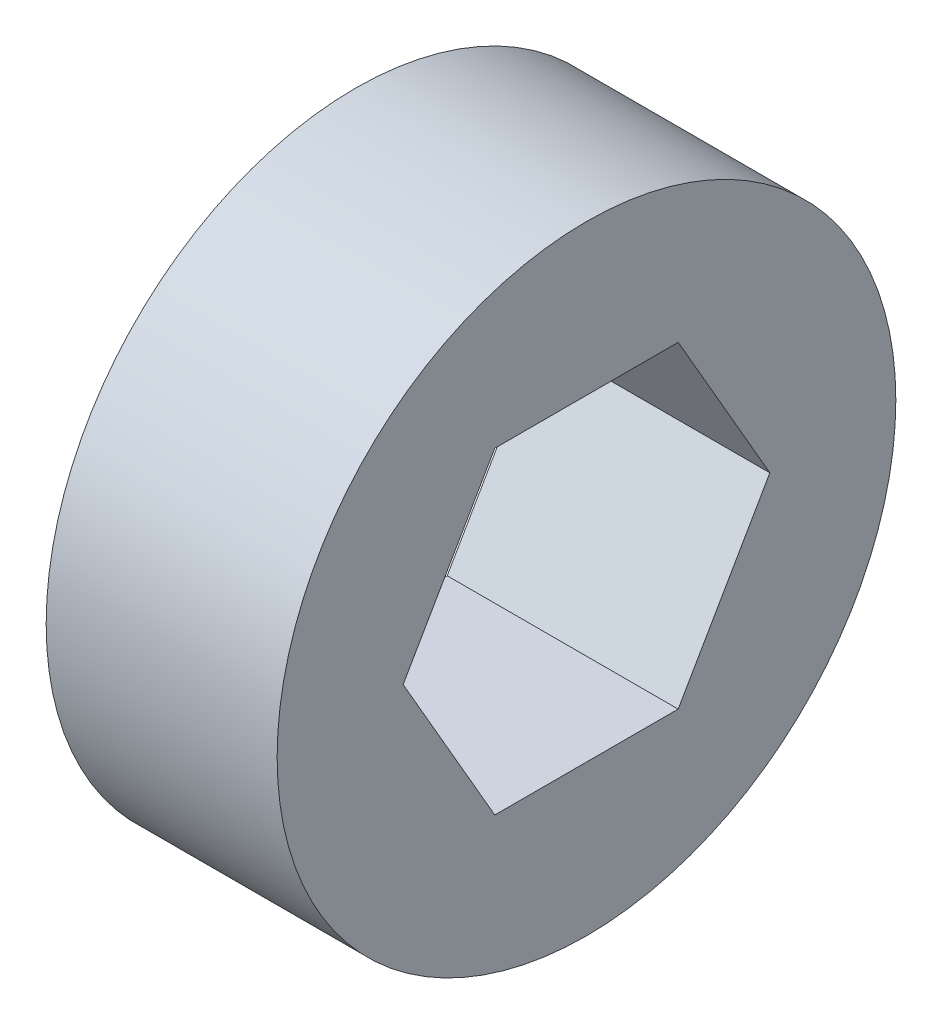
ISO-10303-21;
HEADER;
FILE_DESCRIPTION(('STEP AP214'),'2;1');
FILE_NAME('part.step','',(''),(''),'','','');
FILE_SCHEMA(('AUTOMOTIVE_DESIGN { 1 0 10303 214 1 1 1 1 }'));
ENDSEC;
DATA;
#1=APPLICATION_CONTEXT('core data for automotive mechanical design processes');
#2=APPLICATION_PROTOCOL_DEFINITION('international standard','automotive_design',2000,#1);
#3=PRODUCT_CONTEXT('',#1,'mechanical');
#4=PRODUCT('Part','Part','',(#3));
#5=PRODUCT_RELATED_PRODUCT_CATEGORY('part','',(#4));
#6=PRODUCT_DEFINITION_FORMATION('','',#4);
#7=PRODUCT_DEFINITION_CONTEXT('part definition',#1,'design');
#8=PRODUCT_DEFINITION('design','',#6,#7);
#9=PRODUCT_DEFINITION_SHAPE('','',#8);
#10=(LENGTH_UNIT() NAMED_UNIT(*) SI_UNIT(.MILLI.,.METRE.));
#11=(NAMED_UNIT(*) PLANE_ANGLE_UNIT() SI_UNIT($,.RADIAN.));
#12=(NAMED_UNIT(*) SI_UNIT($,.STERADIAN.) SOLID_ANGLE_UNIT());
#13=UNCERTAINTY_MEASURE_WITH_UNIT(LENGTH_MEASURE(1.E-05),#10,'distance_accuracy_value','');
#14=(GEOMETRIC_REPRESENTATION_CONTEXT(3) GLOBAL_UNCERTAINTY_ASSIGNED_CONTEXT((#13)) GLOBAL_UNIT_ASSIGNED_CONTEXT((#10,
#11,#12)) REPRESENTATION_CONTEXT('',''));
#15=CARTESIAN_POINT('',(0.,0.,0.));
#16=DIRECTION('',(0.,0.,1.));
#17=DIRECTION('',(1.,0.,0.));
#18=AXIS2_PLACEMENT_3D('',#15,#16,#17);
#19=CARTESIAN_POINT('',(7.112,0.,0.));
#20=DIRECTION('',(1.,0.,0.));
#21=DIRECTION('',(0.,0.,-1.));
#22=AXIS2_PLACEMENT_3D('',#19,#20,#21);
#23=PLANE('',#22);
#24=CARTESIAN_POINT('',(7.112,0.,0.));
#25=DIRECTION('',(1.,0.,0.));
#26=DIRECTION('',(0.,0.,-1.));
#27=AXIS2_PLACEMENT_3D('',#24,#25,#26);
#28=CIRCLE('',#27,9.525);
#29=CARTESIAN_POINT('',(7.112,0.,-9.525));
#30=VERTEX_POINT('',#29);
#31=EDGE_CURVE('E11',#30,#30,#28,.T.);
#32=ORIENTED_EDGE('',*,*,#31,.T.);
#33=EDGE_LOOP('',(#32));
#34=FACE_BOUND('',#33,.T.);
#35=DIRECTION('',(0.,0.866025403784439,0.5));
#36=VECTOR('',#35,1.);
#37=CARTESIAN_POINT('',(7.112,0.,-5.64590828240535));
#38=LINE('',#37,#36);
#39=CARTESIAN_POINT('',(7.112,0.,-5.64590828240535));
#40=VERTEX_POINT('',#39);
#41=CARTESIAN_POINT('',(7.112,4.8895,-2.82295414120267));
#42=VERTEX_POINT('',#41);
#43=EDGE_CURVE('E100',#40,#42,#38,.T.);
#44=ORIENTED_EDGE('',*,*,#43,.F.);
#45=DIRECTION('',(0.,0.866025403784439,-0.5));
#46=VECTOR('',#45,1.);
#47=CARTESIAN_POINT('',(7.112,-4.8895,-2.82295414120267));
#48=LINE('',#47,#46);
#49=CARTESIAN_POINT('',(7.112,-4.8895,-2.82295414120267));
#50=VERTEX_POINT('',#49);
#51=EDGE_CURVE('E92',#50,#40,#48,.T.);
#52=ORIENTED_EDGE('',*,*,#51,.F.);
#53=DIRECTION('',(0.,0.,-1.));
#54=VECTOR('',#53,1.);
#55=CARTESIAN_POINT('',(7.112,-4.8895,2.82295414120267));
#56=LINE('',#55,#54);
#57=CARTESIAN_POINT('',(7.112,-4.8895,2.82295414120267));
#58=VERTEX_POINT('',#57);
#59=EDGE_CURVE('E120',#58,#50,#56,.T.);
#60=ORIENTED_EDGE('',*,*,#59,.F.);
#61=DIRECTION('',(0.,-0.866025403784438,-0.5));
#62=VECTOR('',#61,1.);
#63=CARTESIAN_POINT('',(7.112,0.,5.64590828240535));
#64=LINE('',#63,#62);
#65=CARTESIAN_POINT('',(7.112,0.,5.64590828240535));
#66=VERTEX_POINT('',#65);
#67=EDGE_CURVE('E118',#66,#58,#64,.T.);
#68=ORIENTED_EDGE('',*,*,#67,.F.);
#69=DIRECTION('',(0.,-0.866025403784439,0.5));
#70=VECTOR('',#69,1.);
#71=CARTESIAN_POINT('',(7.112,4.8895,2.82295414120268));
#72=LINE('',#71,#70);
#73=CARTESIAN_POINT('',(7.112,4.8895,2.82295414120268));
#74=VERTEX_POINT('',#73);
#75=EDGE_CURVE('E114',#74,#66,#72,.T.);
#76=ORIENTED_EDGE('',*,*,#75,.F.);
#77=DIRECTION('',(0.,0.,1.));
#78=VECTOR('',#77,1.);
#79=CARTESIAN_POINT('',(7.112,4.8895,-2.82295414120267));
#80=LINE('',#79,#78);
#81=EDGE_CURVE('E112',#42,#74,#80,.T.);
#82=ORIENTED_EDGE('',*,*,#81,.F.);
#83=EDGE_LOOP('',(#44,#52,#60,#68,#76,#82));
#84=FACE_BOUND('',#83,.T.);
#85=ADVANCED_FACE('F39',(#34,#84),#23,.T.);
#86=CARTESIAN_POINT('',(0.,0.,0.));
#87=DIRECTION('',(1.,0.,0.));
#88=DIRECTION('',(0.,0.,-1.));
#89=AXIS2_PLACEMENT_3D('',#86,#87,#88);
#90=PLANE('',#89);
#91=CARTESIAN_POINT('',(0.,0.,0.));
#92=DIRECTION('',(1.,0.,0.));
#93=DIRECTION('',(0.,0.,-1.));
#94=AXIS2_PLACEMENT_3D('',#91,#92,#93);
#95=CIRCLE('',#94,9.525);
#96=CARTESIAN_POINT('',(0.,0.,-9.525));
#97=VERTEX_POINT('',#96);
#98=EDGE_CURVE('E43',#97,#97,#95,.T.);
#99=ORIENTED_EDGE('',*,*,#98,.F.);
#100=EDGE_LOOP('',(#99));
#101=FACE_BOUND('',#100,.T.);
#102=DIRECTION('',(0.,0.866025403784439,-0.5));
#103=VECTOR('',#102,1.);
#104=CARTESIAN_POINT('',(0.,-4.8895,-2.82295414120267));
#105=LINE('',#104,#103);
#106=CARTESIAN_POINT('',(0.,-4.8895,-2.82295414120267));
#107=VERTEX_POINT('',#106);
#108=CARTESIAN_POINT('',(0.,0.,-5.64590828240535));
#109=VERTEX_POINT('',#108);
#110=EDGE_CURVE('E62',#107,#109,#105,.T.);
#111=ORIENTED_EDGE('',*,*,#110,.T.);
#112=DIRECTION('',(0.,0.866025403784439,0.5));
#113=VECTOR('',#112,1.);
#114=CARTESIAN_POINT('',(0.,0.,-5.64590828240535));
#115=LINE('',#114,#113);
#116=CARTESIAN_POINT('',(0.,4.8895,-2.82295414120267));
#117=VERTEX_POINT('',#116);
#118=EDGE_CURVE('E107',#109,#117,#115,.T.);
#119=ORIENTED_EDGE('',*,*,#118,.T.);
#120=DIRECTION('',(0.,0.,1.));
#121=VECTOR('',#120,1.);
#122=CARTESIAN_POINT('',(0.,4.8895,-2.82295414120267));
#123=LINE('',#122,#121);
#124=CARTESIAN_POINT('',(0.,4.8895,2.82295414120268));
#125=VERTEX_POINT('',#124);
#126=EDGE_CURVE('E124',#117,#125,#123,.T.);
#127=ORIENTED_EDGE('',*,*,#126,.T.);
#128=DIRECTION('',(0.,-0.866025403784439,0.5));
#129=VECTOR('',#128,1.);
#130=CARTESIAN_POINT('',(0.,4.8895,2.82295414120268));
#131=LINE('',#130,#129);
#132=CARTESIAN_POINT('',(0.,0.,5.64590828240535));
#133=VERTEX_POINT('',#132);
#134=EDGE_CURVE('E127',#125,#133,#131,.T.);
#135=ORIENTED_EDGE('',*,*,#134,.T.);
#136=DIRECTION('',(0.,-0.866025403784438,-0.5));
#137=VECTOR('',#136,1.);
#138=CARTESIAN_POINT('',(0.,0.,5.64590828240535));
#139=LINE('',#138,#137);
#140=CARTESIAN_POINT('',(0.,-4.8895,2.82295414120267));
#141=VERTEX_POINT('',#140);
#142=EDGE_CURVE('E130',#133,#141,#139,.T.);
#143=ORIENTED_EDGE('',*,*,#142,.T.);
#144=DIRECTION('',(0.,0.,-1.));
#145=VECTOR('',#144,1.);
#146=CARTESIAN_POINT('',(0.,-4.8895,2.82295414120267));
#147=LINE('',#146,#145);
#148=EDGE_CURVE('E101',#141,#107,#147,.T.);
#149=ORIENTED_EDGE('',*,*,#148,.T.);
#150=EDGE_LOOP('',(#111,#119,#127,#135,#143,#149));
#151=FACE_BOUND('',#150,.T.);
#152=ADVANCED_FACE('F147',(#101,#151),#90,.F.);
#153=CARTESIAN_POINT('',(7.112,0.,0.));
#154=DIRECTION('',(-1.,0.,0.));
#155=DIRECTION('',(0.,0.,1.));
#156=AXIS2_PLACEMENT_3D('',#153,#154,#155);
#157=CYLINDRICAL_SURFACE('',#156,9.525);
#158=ORIENTED_EDGE('',*,*,#31,.F.);
#159=EDGE_LOOP('',(#158));
#160=FACE_BOUND('',#159,.T.);
#161=ORIENTED_EDGE('',*,*,#98,.T.);
#162=EDGE_LOOP('',(#161));
#163=FACE_BOUND('',#162,.T.);
#164=ADVANCED_FACE('F41',(#160,#163),#157,.T.);
#165=CARTESIAN_POINT('',(7.112,-4.8895,-2.82295414120267));
#166=DIRECTION('',(0.,0.5,0.866025403784438));
#167=DIRECTION('',(0.,-0.866025403784439,0.5));
#168=AXIS2_PLACEMENT_3D('',#165,#166,#167);
#169=PLANE('',#168);
#170=ORIENTED_EDGE('',*,*,#110,.F.);
#171=DIRECTION('',(-1.,0.,0.));
#172=VECTOR('',#171,1.);
#173=CARTESIAN_POINT('',(7.112,-4.8895,-2.82295414120267));
#174=LINE('',#173,#172);
#175=EDGE_CURVE('E96',#50,#107,#174,.T.);
#176=ORIENTED_EDGE('',*,*,#175,.F.);
#177=ORIENTED_EDGE('',*,*,#51,.T.);
#178=DIRECTION('',(-1.,0.,0.));
#179=VECTOR('',#178,1.);
#180=CARTESIAN_POINT('',(7.112,0.,-5.64590828240535));
#181=LINE('',#180,#179);
#182=EDGE_CURVE('E95',#40,#109,#181,.T.);
#183=ORIENTED_EDGE('',*,*,#182,.T.);
#184=EDGE_LOOP('',(#170,#176,#177,#183));
#185=FACE_BOUND('',#184,.T.);
#186=ADVANCED_FACE('F94',(#185),#169,.T.);
#187=CARTESIAN_POINT('',(7.112,0.,-5.64590828240535));
#188=DIRECTION('',(0.,-0.5,0.866025403784438));
#189=DIRECTION('',(0.,-0.866025403784439,-0.5));
#190=AXIS2_PLACEMENT_3D('',#187,#188,#189);
#191=PLANE('',#190);
#192=ORIENTED_EDGE('',*,*,#118,.F.);
#193=ORIENTED_EDGE('',*,*,#182,.F.);
#194=ORIENTED_EDGE('',*,*,#43,.T.);
#195=DIRECTION('',(-1.,0.,0.));
#196=VECTOR('',#195,1.);
#197=CARTESIAN_POINT('',(7.112,4.8895,-2.82295414120267));
#198=LINE('',#197,#196);
#199=EDGE_CURVE('E108',#42,#117,#198,.T.);
#200=ORIENTED_EDGE('',*,*,#199,.T.);
#201=EDGE_LOOP('',(#192,#193,#194,#200));
#202=FACE_BOUND('',#201,.T.);
#203=ADVANCED_FACE('F104',(#202),#191,.T.);
#204=CARTESIAN_POINT('',(7.112,4.8895,-2.82295414120267));
#205=DIRECTION('',(0.,-1.,0.));
#206=DIRECTION('',(0.,0.,-1.));
#207=AXIS2_PLACEMENT_3D('',#204,#205,#206);
#208=PLANE('',#207);
#209=ORIENTED_EDGE('',*,*,#126,.F.);
#210=ORIENTED_EDGE('',*,*,#199,.F.);
#211=ORIENTED_EDGE('',*,*,#81,.T.);
#212=DIRECTION('',(-1.,0.,0.));
#213=VECTOR('',#212,1.);
#214=CARTESIAN_POINT('',(7.112,4.8895,2.82295414120268));
#215=LINE('',#214,#213);
#216=EDGE_CURVE('E139',#74,#125,#215,.T.);
#217=ORIENTED_EDGE('',*,*,#216,.T.);
#218=EDGE_LOOP('',(#209,#210,#211,#217));
#219=FACE_BOUND('',#218,.T.);
#220=ADVANCED_FACE('F143',(#219),#208,.T.);
#221=CARTESIAN_POINT('',(7.112,4.8895,2.82295414120268));
#222=DIRECTION('',(0.,-0.5,-0.866025403784439));
#223=DIRECTION('',(0.,0.866025403784439,-0.5));
#224=AXIS2_PLACEMENT_3D('',#221,#222,#223);
#225=PLANE('',#224);
#226=ORIENTED_EDGE('',*,*,#134,.F.);
#227=ORIENTED_EDGE('',*,*,#216,.F.);
#228=ORIENTED_EDGE('',*,*,#75,.T.);
#229=DIRECTION('',(-1.,0.,0.));
#230=VECTOR('',#229,1.);
#231=CARTESIAN_POINT('',(7.112,0.,5.64590828240535));
#232=LINE('',#231,#230);
#233=EDGE_CURVE('E137',#66,#133,#232,.T.);
#234=ORIENTED_EDGE('',*,*,#233,.T.);
#235=EDGE_LOOP('',(#226,#227,#228,#234));
#236=FACE_BOUND('',#235,.T.);
#237=ADVANCED_FACE('F155',(#236),#225,.T.);
#238=CARTESIAN_POINT('',(7.112,0.,5.64590828240535));
#239=DIRECTION('',(0.,0.5,-0.866025403784439));
#240=DIRECTION('',(0.,0.866025403784439,0.5));
#241=AXIS2_PLACEMENT_3D('',#238,#239,#240);
#242=PLANE('',#241);
#243=ORIENTED_EDGE('',*,*,#142,.F.);
#244=ORIENTED_EDGE('',*,*,#233,.F.);
#245=ORIENTED_EDGE('',*,*,#67,.T.);
#246=DIRECTION('',(-1.,0.,0.));
#247=VECTOR('',#246,1.);
#248=CARTESIAN_POINT('',(7.112,-4.8895,2.82295414120267));
#249=LINE('',#248,#247);
#250=EDGE_CURVE('E54',#58,#141,#249,.T.);
#251=ORIENTED_EDGE('',*,*,#250,.T.);
#252=EDGE_LOOP('',(#243,#244,#245,#251));
#253=FACE_BOUND('',#252,.T.);
#254=ADVANCED_FACE('F153',(#253),#242,.T.);
#255=CARTESIAN_POINT('',(7.112,-4.8895,2.82295414120267));
#256=DIRECTION('',(0.,1.,0.));
#257=DIRECTION('',(0.,0.,1.));
#258=AXIS2_PLACEMENT_3D('',#255,#256,#257);
#259=PLANE('',#258);
#260=ORIENTED_EDGE('',*,*,#148,.F.);
#261=ORIENTED_EDGE('',*,*,#250,.F.);
#262=ORIENTED_EDGE('',*,*,#59,.T.);
#263=ORIENTED_EDGE('',*,*,#175,.T.);
#264=EDGE_LOOP('',(#260,#261,#262,#263));
#265=FACE_BOUND('',#264,.T.);
#266=ADVANCED_FACE('F149',(#265),#259,.T.);
#267=CLOSED_SHELL('',(#85,#152,#164,#186,#203,#220,#237,#254,#266));
#268=MANIFOLD_SOLID_BREP('B2',#267);
#269=ADVANCED_BREP_SHAPE_REPRESENTATION('',(#18,#268),#14);
#270=SHAPE_DEFINITION_REPRESENTATION(#9,#269);
ENDSEC;
END-ISO-10303-21;
